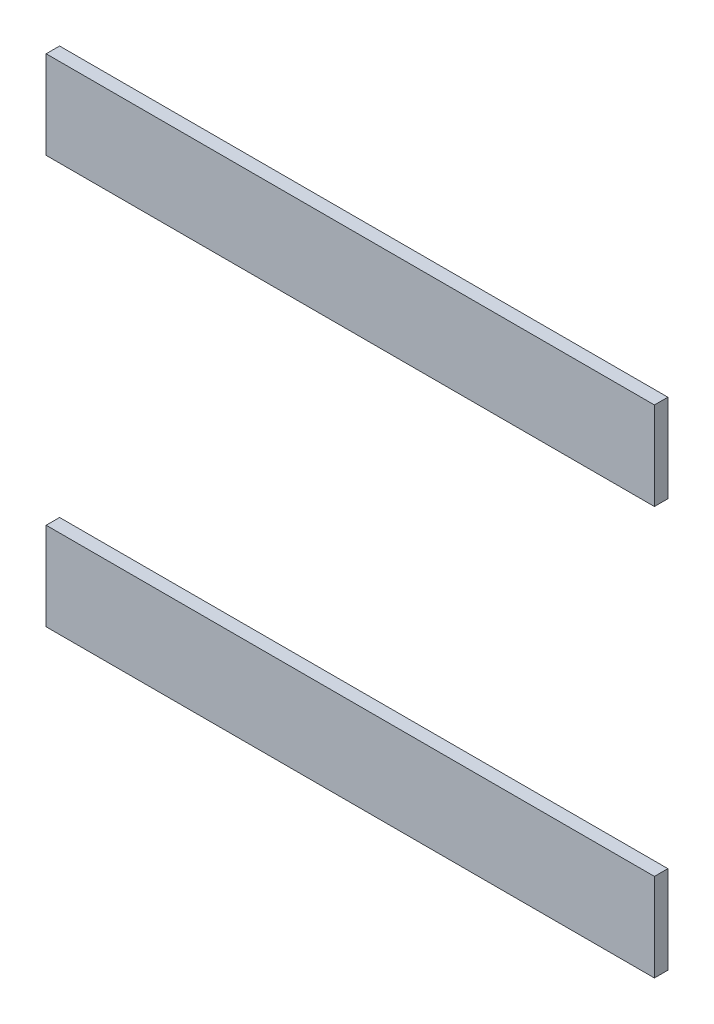
ISO-10303-21;
HEADER;
FILE_DESCRIPTION(('STEP AP214'),'2;1');
FILE_NAME('part.step','',(''),(''),'','','');
FILE_SCHEMA(('AUTOMOTIVE_DESIGN { 1 0 10303 214 1 1 1 1 }'));
ENDSEC;
DATA;
#1=APPLICATION_CONTEXT('core data for automotive mechanical design processes');
#2=APPLICATION_PROTOCOL_DEFINITION('international standard','automotive_design',2000,#1);
#3=PRODUCT_CONTEXT('',#1,'mechanical');
#4=PRODUCT('Part','Part','',(#3));
#5=PRODUCT_RELATED_PRODUCT_CATEGORY('part','',(#4));
#6=PRODUCT_DEFINITION_FORMATION('','',#4);
#7=PRODUCT_DEFINITION_CONTEXT('part definition',#1,'design');
#8=PRODUCT_DEFINITION('design','',#6,#7);
#9=PRODUCT_DEFINITION_SHAPE('','',#8);
#10=(LENGTH_UNIT() NAMED_UNIT(*) SI_UNIT(.MILLI.,.METRE.));
#11=(NAMED_UNIT(*) PLANE_ANGLE_UNIT() SI_UNIT($,.RADIAN.));
#12=(NAMED_UNIT(*) SI_UNIT($,.STERADIAN.) SOLID_ANGLE_UNIT());
#13=UNCERTAINTY_MEASURE_WITH_UNIT(LENGTH_MEASURE(1.E-05),#10,'distance_accuracy_value','');
#14=(GEOMETRIC_REPRESENTATION_CONTEXT(3) GLOBAL_UNCERTAINTY_ASSIGNED_CONTEXT((#13)) GLOBAL_UNIT_ASSIGNED_CONTEXT((#10,
#11,#12)) REPRESENTATION_CONTEXT('',''));
#15=CARTESIAN_POINT('',(0.,0.,0.));
#16=DIRECTION('',(0.,0.,1.));
#17=DIRECTION('',(1.,0.,0.));
#18=AXIS2_PLACEMENT_3D('',#15,#16,#17);
#19=CARTESIAN_POINT('',(48.63881830312,80.500001148808,0.622470172692));
#20=DIRECTION('',(0.,0.,-1.));
#21=DIRECTION('',(-1.,0.,0.));
#22=AXIS2_PLACEMENT_3D('',#19,#20,#21);
#23=PLANE('',#22);
#24=DIRECTION('',(-0.999999999999985,-1.74845553146897E-07,0.));
#25=VECTOR('',#24,1.);
#26=CARTESIAN_POINT('',(45.500000772221,83.0610006,0.622470172692));
#27=LINE('',#26,#25);
#28=CARTESIAN_POINT('',(48.6388178553409,83.0610006,0.622470172692));
#29=VERTEX_POINT('',#28);
#30=CARTESIAN_POINT('',(42.3611837684916,83.061000051192,0.622470172692));
#31=VERTEX_POINT('',#30);
#32=EDGE_CURVE('P0_E55',#29,#31,#27,.T.);
#33=ORIENTED_EDGE('',*,*,#32,.F.);
#34=DIRECTION('',(-1.74845553146897E-07,0.999999999999985,0.));
#35=VECTOR('',#34,1.);
#36=CARTESIAN_POINT('',(48.63881830312,80.500001148808,0.622470172692));
#37=LINE('',#36,#35);
#38=CARTESIAN_POINT('',(48.6388179744281,82.15286995523,0.622470172692));
#39=VERTEX_POINT('',#38);
#40=EDGE_CURVE('P0_E68',#39,#29,#37,.T.);
#41=ORIENTED_EDGE('',*,*,#40,.F.);
#42=DIRECTION('',(-0.999999999999985,-1.74845553146897E-07,0.));
#43=VECTOR('',#42,1.);
#44=CARTESIAN_POINT('',(49.688012701857,82.152870138677,0.622470172692));
#45=LINE('',#44,#43);
#46=CARTESIAN_POINT('',(42.3611838478831,82.1528694064216,0.622470172692));
#47=VERTEX_POINT('',#46);
#48=EDGE_CURVE('P0_E61',#39,#47,#45,.T.);
#49=ORIENTED_EDGE('',*,*,#48,.T.);
#50=DIRECTION('',(0.,1.,0.));
#51=VECTOR('',#50,1.);
#52=CARTESIAN_POINT('',(42.361183847883,80.500001148808,0.622470172692));
#53=LINE('',#52,#51);
#54=EDGE_CURVE('P0_E20',#47,#31,#53,.T.);
#55=ORIENTED_EDGE('',*,*,#54,.T.);
#56=EDGE_LOOP('',(#33,#41,#49,#55));
#57=FACE_BOUND('',#56,.T.);
#58=ADVANCED_FACE('P0_F17',(#57),#23,.T.);
#59=CARTESIAN_POINT('',(49.688012701857,82.152870138677,0.761249944285));
#60=DIRECTION('',(-1.74845553146897E-07,0.999999999999985,0.));
#61=DIRECTION('',(-0.999999999999985,-1.74845553146897E-07,0.));
#62=AXIS2_PLACEMENT_3D('',#59,#60,#61);
#63=PLANE('',#62);
#64=DIRECTION('',(1.,0.,0.));
#65=VECTOR('',#64,1.);
#66=CARTESIAN_POINT('',(42.36118413688,82.152868857613,0.761249944285));
#67=LINE('',#66,#65);
#68=CARTESIAN_POINT('',(42.3611838081873,82.1528688576133,0.761249944285));
#69=VERTEX_POINT('',#68);
#70=CARTESIAN_POINT('',(48.6388180141238,82.1528696808257,0.761249944285));
#71=VERTEX_POINT('',#70);
#72=EDGE_CURVE('P0_E83',#69,#71,#67,.T.);
#73=ORIENTED_EDGE('',*,*,#72,.F.);
#74=DIRECTION('',(0.,0.,1.));
#75=VECTOR('',#74,1.);
#76=CARTESIAN_POINT('',(42.3611838478832,82.152868857613,0.622470172692));
#77=LINE('',#76,#75);
#78=EDGE_CURVE('P0_E67',#47,#69,#77,.T.);
#79=ORIENTED_EDGE('',*,*,#78,.F.);
#80=ORIENTED_EDGE('',*,*,#48,.F.);
#81=DIRECTION('',(0.,0.,1.));
#82=VECTOR('',#81,1.);
#83=CARTESIAN_POINT('',(48.6388180141232,82.15286995523,0.761249944285));
#84=LINE('',#83,#82);
#85=EDGE_CURVE('P0_E64',#71,#39,#84,.F.);
#86=ORIENTED_EDGE('',*,*,#85,.F.);
#87=EDGE_LOOP('',(#73,#79,#80,#86));
#88=FACE_BOUND('',#87,.T.);
#89=ADVANCED_FACE('P0_F62',(#88),#63,.F.);
#90=CARTESIAN_POINT('',(48.63881830312,80.500001148808,0.761249944285));
#91=DIRECTION('',(0.999999999999985,1.74845553146897E-07,0.));
#92=DIRECTION('',(-1.74845553146897E-07,0.999999999999985,0.));
#93=AXIS2_PLACEMENT_3D('',#90,#91,#92);
#94=PLANE('',#93);
#95=DIRECTION('',(0.,0.,1.));
#96=VECTOR('',#95,1.);
#97=CARTESIAN_POINT('',(48.638817855341,83.0610011488082,0.691860058489));
#98=LINE('',#97,#96);
#99=CARTESIAN_POINT('',(48.6388178950365,83.061001148808,0.761249944285));
#100=VERTEX_POINT('',#99);
#101=EDGE_CURVE('P0_E79',#100,#29,#98,.F.);
#102=ORIENTED_EDGE('',*,*,#101,.F.);
#103=DIRECTION('',(0.,1.,0.));
#104=VECTOR('',#103,1.);
#105=CARTESIAN_POINT('',(48.638818014124,80.500000051192,0.761249944285));
#106=LINE('',#105,#104);
#107=EDGE_CURVE('P0_E74',#71,#100,#106,.T.);
#108=ORIENTED_EDGE('',*,*,#107,.F.);
#109=ORIENTED_EDGE('',*,*,#85,.T.);
#110=ORIENTED_EDGE('',*,*,#40,.T.);
#111=EDGE_LOOP('',(#102,#108,#109,#110));
#112=FACE_BOUND('',#111,.T.);
#113=ADVANCED_FACE('P0_F72',(#112),#94,.T.);
#114=CARTESIAN_POINT('',(45.500000772221,83.0610006,0.691860058489));
#115=DIRECTION('',(-1.74845553146897E-07,0.999999999999985,0.));
#116=DIRECTION('',(-0.999999999999985,-1.74845553146897E-07,0.));
#117=AXIS2_PLACEMENT_3D('',#114,#115,#116);
#118=PLANE('',#117);
#119=DIRECTION('',(1.,0.,0.));
#120=VECTOR('',#119,1.);
#121=CARTESIAN_POINT('',(42.36118413688,83.061001148808,0.761249944285));
#122=LINE('',#121,#120);
#123=CARTESIAN_POINT('',(42.3611836891001,83.0610003255959,0.761249944285));
#124=VERTEX_POINT('',#123);
#125=EDGE_CURVE('P0_E26',#100,#124,#122,.F.);
#126=ORIENTED_EDGE('',*,*,#125,.F.);
#127=ORIENTED_EDGE('',*,*,#101,.T.);
#128=ORIENTED_EDGE('',*,*,#32,.T.);
#129=DIRECTION('',(0.,0.,1.));
#130=VECTOR('',#129,1.);
#131=CARTESIAN_POINT('',(42.3611836891005,83.061000051192,0.622470172692));
#132=LINE('',#131,#130);
#133=EDGE_CURVE('P0_E35',#124,#31,#132,.F.);
#134=ORIENTED_EDGE('',*,*,#133,.F.);
#135=EDGE_LOOP('',(#126,#127,#128,#134));
#136=FACE_BOUND('',#135,.T.);
#137=ADVANCED_FACE('P0_F89',(#136),#118,.T.);
#138=CARTESIAN_POINT('',(42.36118413688,80.500000051192,0.622470172692));
#139=DIRECTION('',(-0.999999999999985,-1.74845553146897E-07,0.));
#140=DIRECTION('',(1.74845553146897E-07,-0.999999999999985,0.));
#141=AXIS2_PLACEMENT_3D('',#138,#139,#140);
#142=PLANE('',#141);
#143=ORIENTED_EDGE('',*,*,#133,.T.);
#144=ORIENTED_EDGE('',*,*,#54,.F.);
#145=ORIENTED_EDGE('',*,*,#78,.T.);
#146=DIRECTION('',(0.,1.,0.));
#147=VECTOR('',#146,1.);
#148=CARTESIAN_POINT('',(42.3611836891,80.500000051192,0.761249944285));
#149=LINE('',#148,#147);
#150=EDGE_CURVE('P0_E11',#124,#69,#149,.F.);
#151=ORIENTED_EDGE('',*,*,#150,.F.);
#152=EDGE_LOOP('',(#143,#144,#145,#151));
#153=FACE_BOUND('',#152,.T.);
#154=ADVANCED_FACE('P0_F91',(#153),#142,.T.);
#155=CARTESIAN_POINT('',(42.36118413688,80.500000051192,0.761249944285));
#156=DIRECTION('',(0.,0.,1.));
#157=DIRECTION('',(1.,0.,0.));
#158=AXIS2_PLACEMENT_3D('',#155,#156,#157);
#159=PLANE('',#158);
#160=ORIENTED_EDGE('',*,*,#125,.T.);
#161=ORIENTED_EDGE('',*,*,#150,.T.);
#162=ORIENTED_EDGE('',*,*,#72,.T.);
#163=ORIENTED_EDGE('',*,*,#107,.T.);
#164=EDGE_LOOP('',(#160,#161,#162,#163));
#165=FACE_BOUND('',#164,.T.);
#166=ADVANCED_FACE('P0_F88',(#165),#159,.T.);
#167=CLOSED_SHELL('',(#58,#89,#113,#137,#154,#166));
#168=MANIFOLD_SOLID_BREP('P0_B1',#167);
#169=CARTESIAN_POINT('',(48.63881830312,80.500001148808,0.622470172692));
#170=DIRECTION('',(0.,0.,-1.));
#171=DIRECTION('',(-1.,0.,0.));
#172=AXIS2_PLACEMENT_3D('',#169,#170,#171);
#173=PLANE('',#172);
#174=DIRECTION('',(0.999999999999985,1.74845553146897E-07,0.));
#175=VECTOR('',#174,1.);
#176=CARTESIAN_POINT('',(45.500001667779,77.9390006,0.622470172692));
#177=LINE('',#176,#175);
#178=CARTESIAN_POINT('',(42.3611845846591,77.9390005999999,0.622470172692));
#179=VERTEX_POINT('',#178);
#180=CARTESIAN_POINT('',(48.6388186715084,77.9390011488081,0.622470172692));
#181=VERTEX_POINT('',#180);
#182=EDGE_CURVE('P1_E55',#179,#181,#177,.T.);
#183=ORIENTED_EDGE('',*,*,#182,.F.);
#184=DIRECTION('',(1.74845553146897E-07,-0.999999999999985,0.));
#185=VECTOR('',#184,1.);
#186=CARTESIAN_POINT('',(42.36118413688,80.500000051192,0.622470172692));
#187=LINE('',#186,#185);
#188=CARTESIAN_POINT('',(42.3611844655719,78.84713124477,0.622470172692));
#189=VERTEX_POINT('',#188);
#190=EDGE_CURVE('P1_E68',#189,#179,#187,.T.);
#191=ORIENTED_EDGE('',*,*,#190,.F.);
#192=DIRECTION('',(0.999999999999985,1.74845553146897E-07,0.));
#193=VECTOR('',#192,1.);
#194=CARTESIAN_POINT('',(41.311989738143,78.847131061323,0.622470172692));
#195=LINE('',#194,#193);
#196=CARTESIAN_POINT('',(48.6388185921169,78.8471317935784,0.622470172692));
#197=VERTEX_POINT('',#196);
#198=EDGE_CURVE('P1_E61',#189,#197,#195,.T.);
#199=ORIENTED_EDGE('',*,*,#198,.T.);
#200=DIRECTION('',(0.,1.,0.));
#201=VECTOR('',#200,1.);
#202=CARTESIAN_POINT('',(48.638818592117,80.500001148808,0.622470172692));
#203=LINE('',#202,#201);
#204=EDGE_CURVE('P1_E20',#197,#181,#203,.F.);
#205=ORIENTED_EDGE('',*,*,#204,.T.);
#206=EDGE_LOOP('',(#183,#191,#199,#205));
#207=FACE_BOUND('',#206,.T.);
#208=ADVANCED_FACE('P1_F17',(#207),#173,.T.);
#209=CARTESIAN_POINT('',(41.311989738143,78.847131061323,0.761249944285));
#210=DIRECTION('',(1.74845553146897E-07,-0.999999999999985,0.));
#211=DIRECTION('',(0.999999999999985,1.74845553146897E-07,0.));
#212=AXIS2_PLACEMENT_3D('',#209,#210,#211);
#213=PLANE('',#212);
#214=ORIENTED_EDGE('',*,*,#198,.F.);
#215=DIRECTION('',(0.,0.,1.));
#216=VECTOR('',#215,1.);
#217=CARTESIAN_POINT('',(42.3611844258768,78.84713124477,0.622470172692));
#218=LINE('',#217,#216);
#219=CARTESIAN_POINT('',(42.3611844258762,78.8471315191743,0.761249944285));
#220=VERTEX_POINT('',#219);
#221=EDGE_CURVE('P1_E64',#220,#189,#218,.F.);
#222=ORIENTED_EDGE('',*,*,#221,.F.);
#223=DIRECTION('',(1.,0.,0.));
#224=VECTOR('',#223,1.);
#225=CARTESIAN_POINT('',(42.36118413688,78.847132342387,0.761249944285));
#226=LINE('',#225,#224);
#227=CARTESIAN_POINT('',(48.6388186318127,78.8471323423867,0.761249944285));
#228=VERTEX_POINT('',#227);
#229=EDGE_CURVE('P1_E83',#228,#220,#226,.F.);
#230=ORIENTED_EDGE('',*,*,#229,.F.);
#231=DIRECTION('',(0.,0.,1.));
#232=VECTOR('',#231,1.);
#233=CARTESIAN_POINT('',(48.6388185921168,78.847132342387,0.761249944285));
#234=LINE('',#233,#232);
#235=EDGE_CURVE('P1_E67',#197,#228,#234,.T.);
#236=ORIENTED_EDGE('',*,*,#235,.F.);
#237=EDGE_LOOP('',(#214,#222,#230,#236));
#238=FACE_BOUND('',#237,.T.);
#239=ADVANCED_FACE('P1_F62',(#238),#213,.F.);
#240=CARTESIAN_POINT('',(42.36118413688,80.500000051192,0.622470172692));
#241=DIRECTION('',(-0.999999999999985,-1.74845553146897E-07,0.));
#242=DIRECTION('',(1.74845553146897E-07,-0.999999999999985,0.));
#243=AXIS2_PLACEMENT_3D('',#240,#241,#242);
#244=PLANE('',#243);
#245=DIRECTION('',(0.,0.,1.));
#246=VECTOR('',#245,1.);
#247=CARTESIAN_POINT('',(42.361184584659,77.9390000511918,0.691860058489));
#248=LINE('',#247,#246);
#249=CARTESIAN_POINT('',(42.3611845449635,77.939000051192,0.761249944285));
#250=VERTEX_POINT('',#249);
#251=EDGE_CURVE('P1_E79',#250,#179,#248,.F.);
#252=ORIENTED_EDGE('',*,*,#251,.F.);
#253=DIRECTION('',(0.,1.,0.));
#254=VECTOR('',#253,1.);
#255=CARTESIAN_POINT('',(42.361184425876,80.500000051192,0.761249944285));
#256=LINE('',#255,#254);
#257=EDGE_CURVE('P1_E74',#220,#250,#256,.F.);
#258=ORIENTED_EDGE('',*,*,#257,.F.);
#259=ORIENTED_EDGE('',*,*,#221,.T.);
#260=ORIENTED_EDGE('',*,*,#190,.T.);
#261=EDGE_LOOP('',(#252,#258,#259,#260));
#262=FACE_BOUND('',#261,.T.);
#263=ADVANCED_FACE('P1_F72',(#262),#244,.T.);
#264=CARTESIAN_POINT('',(45.500001667779,77.9390006,0.691860058489));
#265=DIRECTION('',(1.74845553146897E-07,-0.999999999999985,0.));
#266=DIRECTION('',(0.999999999999985,1.74845553146897E-07,0.));
#267=AXIS2_PLACEMENT_3D('',#264,#265,#266);
#268=PLANE('',#267);
#269=DIRECTION('',(1.,0.,0.));
#270=VECTOR('',#269,1.);
#271=CARTESIAN_POINT('',(42.36118413688,77.939000051192,0.761249944285));
#272=LINE('',#271,#270);
#273=CARTESIAN_POINT('',(48.6388187508999,77.9390008744041,0.761249944285));
#274=VERTEX_POINT('',#273);
#275=EDGE_CURVE('P1_E26',#250,#274,#272,.T.);
#276=ORIENTED_EDGE('',*,*,#275,.F.);
#277=ORIENTED_EDGE('',*,*,#251,.T.);
#278=ORIENTED_EDGE('',*,*,#182,.T.);
#279=DIRECTION('',(0.,0.,1.));
#280=VECTOR('',#279,1.);
#281=CARTESIAN_POINT('',(48.6388187508995,77.939001148808,0.761249944285));
#282=LINE('',#281,#280);
#283=EDGE_CURVE('P1_E35',#274,#181,#282,.F.);
#284=ORIENTED_EDGE('',*,*,#283,.F.);
#285=EDGE_LOOP('',(#276,#277,#278,#284));
#286=FACE_BOUND('',#285,.T.);
#287=ADVANCED_FACE('P1_F89',(#286),#268,.T.);
#288=CARTESIAN_POINT('',(48.63881830312,80.500001148808,0.761249944285));
#289=DIRECTION('',(0.999999999999985,1.74845553146897E-07,0.));
#290=DIRECTION('',(-1.74845553146897E-07,0.999999999999985,0.));
#291=AXIS2_PLACEMENT_3D('',#288,#289,#290);
#292=PLANE('',#291);
#293=ORIENTED_EDGE('',*,*,#283,.T.);
#294=ORIENTED_EDGE('',*,*,#204,.F.);
#295=ORIENTED_EDGE('',*,*,#235,.T.);
#296=DIRECTION('',(0.,1.,0.));
#297=VECTOR('',#296,1.);
#298=CARTESIAN_POINT('',(48.6388187509,80.500000051192,0.761249944285));
#299=LINE('',#298,#297);
#300=EDGE_CURVE('P1_E11',#274,#228,#299,.T.);
#301=ORIENTED_EDGE('',*,*,#300,.F.);
#302=EDGE_LOOP('',(#293,#294,#295,#301));
#303=FACE_BOUND('',#302,.T.);
#304=ADVANCED_FACE('P1_F91',(#303),#292,.T.);
#305=CARTESIAN_POINT('',(42.36118413688,80.500000051192,0.761249944285));
#306=DIRECTION('',(0.,0.,1.));
#307=DIRECTION('',(1.,0.,0.));
#308=AXIS2_PLACEMENT_3D('',#305,#306,#307);
#309=PLANE('',#308);
#310=ORIENTED_EDGE('',*,*,#275,.T.);
#311=ORIENTED_EDGE('',*,*,#300,.T.);
#312=ORIENTED_EDGE('',*,*,#229,.T.);
#313=ORIENTED_EDGE('',*,*,#257,.T.);
#314=EDGE_LOOP('',(#310,#311,#312,#313));
#315=FACE_BOUND('',#314,.T.);
#316=ADVANCED_FACE('P1_F88',(#315),#309,.T.);
#317=CLOSED_SHELL('',(#208,#239,#263,#287,#304,#316));
#318=MANIFOLD_SOLID_BREP('P1_B1',#317);
#319=ADVANCED_BREP_SHAPE_REPRESENTATION('',(#18,#168,#318),#14);
#320=SHAPE_DEFINITION_REPRESENTATION(#9,#319);
ENDSEC;
END-ISO-10303-21;
